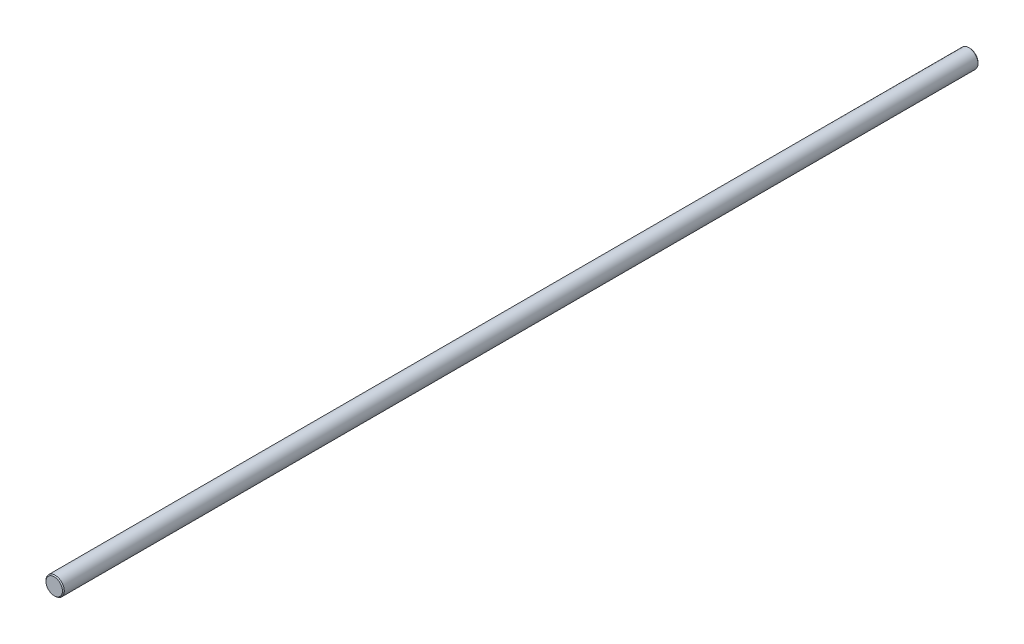
ISO-10303-21;
HEADER;
FILE_DESCRIPTION(('STEP AP214'),'2;1');
FILE_NAME('part.step','',(''),(''),'','','');
FILE_SCHEMA(('AUTOMOTIVE_DESIGN { 1 0 10303 214 1 1 1 1 }'));
ENDSEC;
DATA;
#1=APPLICATION_CONTEXT('core data for automotive mechanical design processes');
#2=APPLICATION_PROTOCOL_DEFINITION('international standard','automotive_design',2000,#1);
#3=PRODUCT_CONTEXT('',#1,'mechanical');
#4=PRODUCT('Part','Part','',(#3));
#5=PRODUCT_RELATED_PRODUCT_CATEGORY('part','',(#4));
#6=PRODUCT_DEFINITION_FORMATION('','',#4);
#7=PRODUCT_DEFINITION_CONTEXT('part definition',#1,'design');
#8=PRODUCT_DEFINITION('design','',#6,#7);
#9=PRODUCT_DEFINITION_SHAPE('','',#8);
#10=(LENGTH_UNIT() NAMED_UNIT(*) SI_UNIT(.MILLI.,.METRE.));
#11=(NAMED_UNIT(*) PLANE_ANGLE_UNIT() SI_UNIT($,.RADIAN.));
#12=(NAMED_UNIT(*) SI_UNIT($,.STERADIAN.) SOLID_ANGLE_UNIT());
#13=UNCERTAINTY_MEASURE_WITH_UNIT(LENGTH_MEASURE(1.E-05),#10,'distance_accuracy_value','');
#14=(GEOMETRIC_REPRESENTATION_CONTEXT(3) GLOBAL_UNCERTAINTY_ASSIGNED_CONTEXT((#13)) GLOBAL_UNIT_ASSIGNED_CONTEXT((#10,
#11,#12)) REPRESENTATION_CONTEXT('',''));
#15=CARTESIAN_POINT('',(0.,0.,0.));
#16=DIRECTION('',(0.,0.,1.));
#17=DIRECTION('',(1.,0.,0.));
#18=AXIS2_PLACEMENT_3D('',#15,#16,#17);
#19=CARTESIAN_POINT('',(0.,0.,500.));
#20=DIRECTION('',(0.,0.,-1.));
#21=DIRECTION('',(-1.,0.,0.));
#22=AXIS2_PLACEMENT_3D('',#19,#20,#21);
#23=CYLINDRICAL_SURFACE('',#22,10.);
#24=CARTESIAN_POINT('',(0.,0.,499.));
#25=DIRECTION('',(0.,0.,1.));
#26=DIRECTION('',(1.,0.,0.));
#27=AXIS2_PLACEMENT_3D('',#24,#25,#26);
#28=CIRCLE('',#27,10.);
#29=CARTESIAN_POINT('',(10.,0.,499.));
#30=VERTEX_POINT('',#29);
#31=EDGE_CURVE('E44',#30,#30,#28,.F.);
#32=ORIENTED_EDGE('',*,*,#31,.T.);
#33=EDGE_LOOP('',(#32));
#34=FACE_BOUND('',#33,.T.);
#35=CARTESIAN_POINT('',(0.,0.,-499.));
#36=DIRECTION('',(0.,0.,1.));
#37=DIRECTION('',(1.,0.,0.));
#38=AXIS2_PLACEMENT_3D('',#35,#36,#37);
#39=CIRCLE('',#38,10.);
#40=CARTESIAN_POINT('',(10.,0.,-499.));
#41=VERTEX_POINT('',#40);
#42=EDGE_CURVE('E48',#41,#41,#39,.T.);
#43=ORIENTED_EDGE('',*,*,#42,.T.);
#44=EDGE_LOOP('',(#43));
#45=FACE_BOUND('',#44,.T.);
#46=ADVANCED_FACE('F37',(#34,#45),#23,.T.);
#47=CARTESIAN_POINT('',(0.,0.,500.));
#48=DIRECTION('',(0.,0.,1.));
#49=DIRECTION('',(1.,0.,0.));
#50=AXIS2_PLACEMENT_3D('',#47,#48,#49);
#51=PLANE('',#50);
#52=CARTESIAN_POINT('',(0.,0.,500.));
#53=DIRECTION('',(0.,0.,1.));
#54=DIRECTION('',(1.,0.,0.));
#55=AXIS2_PLACEMENT_3D('',#52,#53,#54);
#56=CIRCLE('',#55,8.99999999999999);
#57=CARTESIAN_POINT('',(8.99999999999999,0.,500.));
#58=VERTEX_POINT('',#57);
#59=EDGE_CURVE('E52',#58,#58,#56,.T.);
#60=ORIENTED_EDGE('',*,*,#59,.T.);
#61=EDGE_LOOP('',(#60));
#62=FACE_BOUND('',#61,.T.);
#63=ADVANCED_FACE('F58',(#62),#51,.T.);
#64=CARTESIAN_POINT('',(0.,0.,-500.));
#65=DIRECTION('',(0.,0.,1.));
#66=DIRECTION('',(1.,0.,0.));
#67=AXIS2_PLACEMENT_3D('',#64,#65,#66);
#68=PLANE('',#67);
#69=CARTESIAN_POINT('',(0.,0.,-500.));
#70=DIRECTION('',(0.,0.,1.));
#71=DIRECTION('',(1.,0.,0.));
#72=AXIS2_PLACEMENT_3D('',#69,#70,#71);
#73=CIRCLE('',#72,8.99999999999999);
#74=CARTESIAN_POINT('',(8.99999999999999,0.,-500.));
#75=VERTEX_POINT('',#74);
#76=EDGE_CURVE('E10',#75,#75,#73,.F.);
#77=ORIENTED_EDGE('',*,*,#76,.T.);
#78=EDGE_LOOP('',(#77));
#79=FACE_BOUND('',#78,.T.);
#80=ADVANCED_FACE('F62',(#79),#68,.F.);
#81=CARTESIAN_POINT('',(0.,0.,500.));
#82=DIRECTION('',(0.,0.,-1.));
#83=DIRECTION('',(-1.,0.,0.));
#84=AXIS2_PLACEMENT_3D('',#81,#82,#83);
#85=CONICAL_SURFACE('',#84,8.99999999999999,0.785398163397452);
#86=ORIENTED_EDGE('',*,*,#31,.F.);
#87=EDGE_LOOP('',(#86));
#88=FACE_BOUND('',#87,.T.);
#89=ORIENTED_EDGE('',*,*,#59,.F.);
#90=EDGE_LOOP('',(#89));
#91=FACE_BOUND('',#90,.T.);
#92=ADVANCED_FACE('F60',(#88,#91),#85,.T.);
#93=CARTESIAN_POINT('',(0.,0.,-499.));
#94=DIRECTION('',(0.,0.,1.));
#95=DIRECTION('',(1.,0.,0.));
#96=AXIS2_PLACEMENT_3D('',#93,#94,#95);
#97=CONICAL_SURFACE('',#96,10.,0.785398163397452);
#98=ORIENTED_EDGE('',*,*,#76,.F.);
#99=EDGE_LOOP('',(#98));
#100=FACE_BOUND('',#99,.T.);
#101=ORIENTED_EDGE('',*,*,#42,.F.);
#102=EDGE_LOOP('',(#101));
#103=FACE_BOUND('',#102,.T.);
#104=ADVANCED_FACE('F39',(#100,#103),#97,.T.);
#105=CLOSED_SHELL('',(#46,#63,#80,#92,#104));
#106=MANIFOLD_SOLID_BREP('B2',#105);
#107=ADVANCED_BREP_SHAPE_REPRESENTATION('',(#18,#106),#14);
#108=SHAPE_DEFINITION_REPRESENTATION(#9,#107);
ENDSEC;
END-ISO-10303-21;
